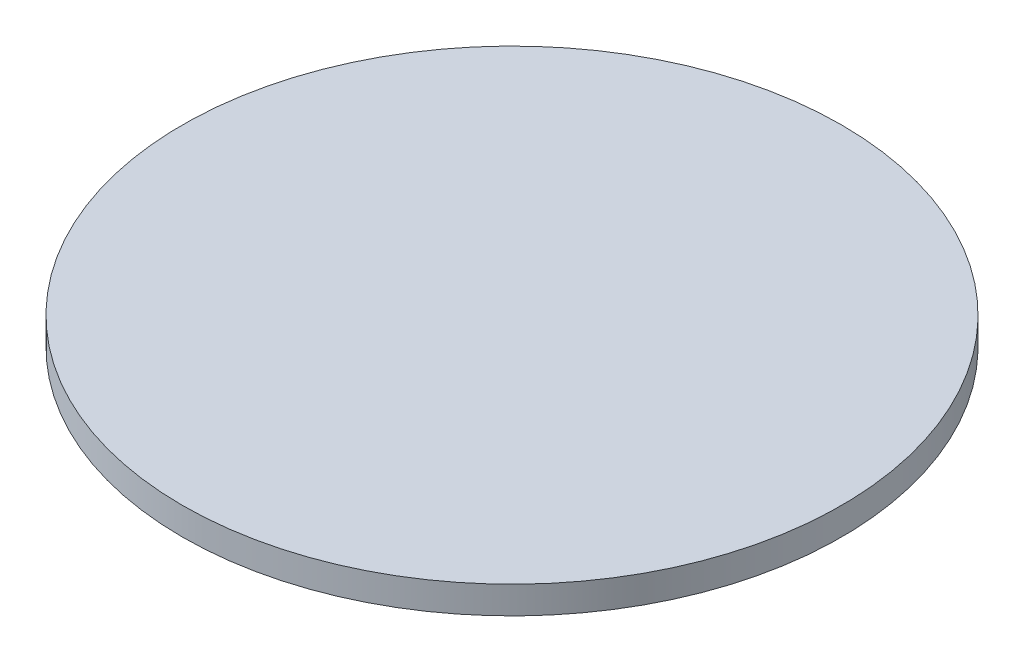
ISO-10303-21;
HEADER;
FILE_DESCRIPTION(('STEP AP214'),'2;1');
FILE_NAME('part.step','',(''),(''),'','','');
FILE_SCHEMA(('AUTOMOTIVE_DESIGN { 1 0 10303 214 1 1 1 1 }'));
ENDSEC;
DATA;
#1=APPLICATION_CONTEXT('core data for automotive mechanical design processes');
#2=APPLICATION_PROTOCOL_DEFINITION('international standard','automotive_design',2000,#1);
#3=PRODUCT_CONTEXT('',#1,'mechanical');
#4=PRODUCT('Part','Part','',(#3));
#5=PRODUCT_RELATED_PRODUCT_CATEGORY('part','',(#4));
#6=PRODUCT_DEFINITION_FORMATION('','',#4);
#7=PRODUCT_DEFINITION_CONTEXT('part definition',#1,'design');
#8=PRODUCT_DEFINITION('design','',#6,#7);
#9=PRODUCT_DEFINITION_SHAPE('','',#8);
#10=(LENGTH_UNIT() NAMED_UNIT(*) SI_UNIT(.MILLI.,.METRE.));
#11=(NAMED_UNIT(*) PLANE_ANGLE_UNIT() SI_UNIT($,.RADIAN.));
#12=(NAMED_UNIT(*) SI_UNIT($,.STERADIAN.) SOLID_ANGLE_UNIT());
#13=UNCERTAINTY_MEASURE_WITH_UNIT(LENGTH_MEASURE(1.E-05),#10,'distance_accuracy_value','');
#14=(GEOMETRIC_REPRESENTATION_CONTEXT(3) GLOBAL_UNCERTAINTY_ASSIGNED_CONTEXT((#13)) GLOBAL_UNIT_ASSIGNED_CONTEXT((#10,
#11,#12)) REPRESENTATION_CONTEXT('',''));
#15=CARTESIAN_POINT('',(0.,0.,0.));
#16=DIRECTION('',(0.,0.,1.));
#17=DIRECTION('',(1.,0.,0.));
#18=AXIS2_PLACEMENT_3D('',#15,#16,#17);
#19=CARTESIAN_POINT('',(0.,3.175,0.));
#20=DIRECTION('',(0.,-1.,0.));
#21=DIRECTION('',(0.,0.,-1.));
#22=AXIS2_PLACEMENT_3D('',#19,#20,#21);
#23=CYLINDRICAL_SURFACE('',#22,38.1);
#24=CARTESIAN_POINT('',(0.,3.175,0.));
#25=DIRECTION('',(0.,1.,0.));
#26=DIRECTION('',(0.,0.,1.));
#27=AXIS2_PLACEMENT_3D('',#24,#25,#26);
#28=CIRCLE('',#27,38.1);
#29=CARTESIAN_POINT('',(0.,3.175,38.1));
#30=VERTEX_POINT('',#29);
#31=EDGE_CURVE('E10',#30,#30,#28,.T.);
#32=ORIENTED_EDGE('',*,*,#31,.F.);
#33=EDGE_LOOP('',(#32));
#34=FACE_BOUND('',#33,.T.);
#35=CARTESIAN_POINT('',(0.,0.,0.));
#36=DIRECTION('',(0.,1.,0.));
#37=DIRECTION('',(0.,0.,1.));
#38=AXIS2_PLACEMENT_3D('',#35,#36,#37);
#39=CIRCLE('',#38,38.1);
#40=CARTESIAN_POINT('',(0.,0.,38.1));
#41=VERTEX_POINT('',#40);
#42=EDGE_CURVE('E40',#41,#41,#39,.T.);
#43=ORIENTED_EDGE('',*,*,#42,.T.);
#44=EDGE_LOOP('',(#43));
#45=FACE_BOUND('',#44,.T.);
#46=ADVANCED_FACE('F37',(#34,#45),#23,.T.);
#47=CARTESIAN_POINT('',(0.,3.175,0.));
#48=DIRECTION('',(0.,1.,0.));
#49=DIRECTION('',(0.,0.,1.));
#50=AXIS2_PLACEMENT_3D('',#47,#48,#49);
#51=PLANE('',#50);
#52=ORIENTED_EDGE('',*,*,#31,.T.);
#53=EDGE_LOOP('',(#52));
#54=FACE_BOUND('',#53,.T.);
#55=ADVANCED_FACE('F54',(#54),#51,.T.);
#56=CARTESIAN_POINT('',(0.,0.,0.));
#57=DIRECTION('',(0.,1.,0.));
#58=DIRECTION('',(0.,0.,1.));
#59=AXIS2_PLACEMENT_3D('',#56,#57,#58);
#60=PLANE('',#59);
#61=ORIENTED_EDGE('',*,*,#42,.F.);
#62=EDGE_LOOP('',(#61));
#63=FACE_BOUND('',#62,.T.);
#64=ADVANCED_FACE('F52',(#63),#60,.F.);
#65=CLOSED_SHELL('',(#46,#55,#64));
#66=MANIFOLD_SOLID_BREP('B2',#65);
#67=ADVANCED_BREP_SHAPE_REPRESENTATION('',(#18,#66),#14);
#68=SHAPE_DEFINITION_REPRESENTATION(#9,#67);
ENDSEC;
END-ISO-10303-21;
